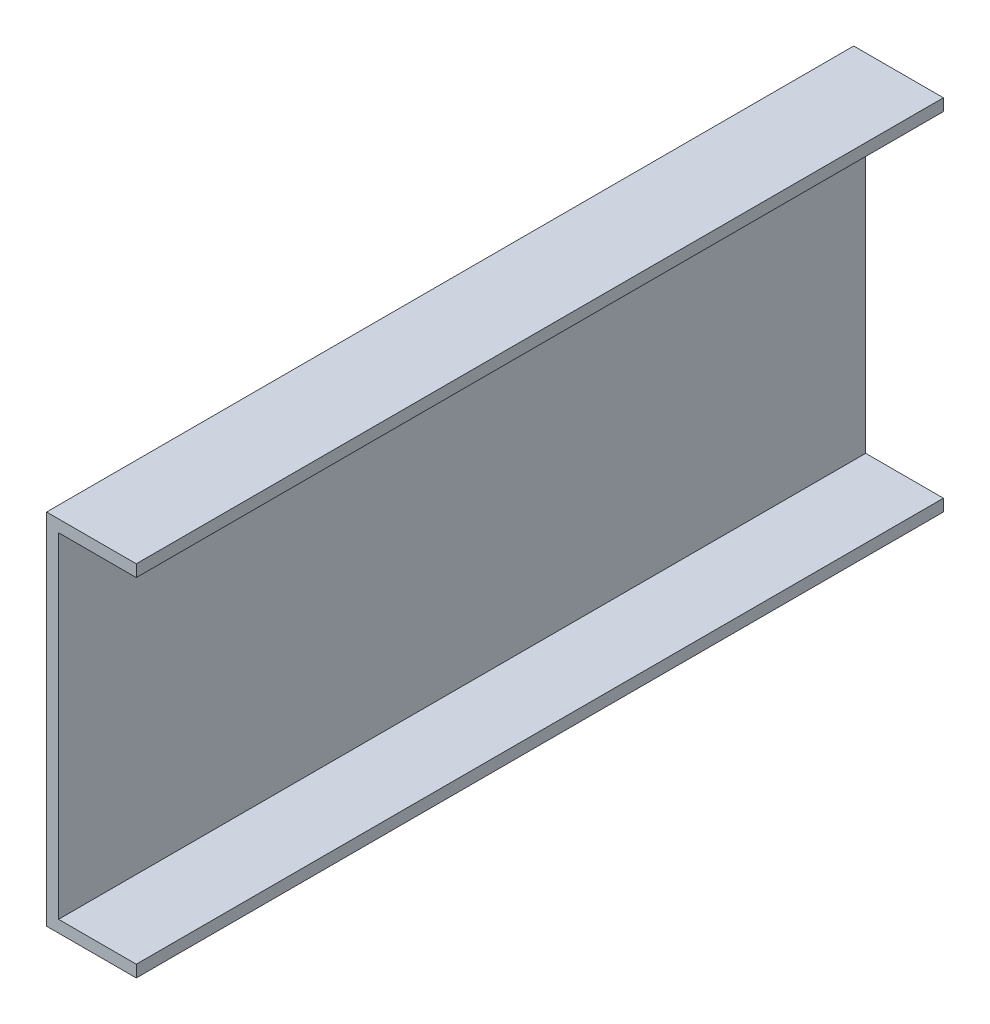
ISO-10303-21;
HEADER;
FILE_DESCRIPTION(('STEP AP214'),'2;1');
FILE_NAME('part.step','',(''),(''),'','','');
FILE_SCHEMA(('AUTOMOTIVE_DESIGN { 1 0 10303 214 1 1 1 1 }'));
ENDSEC;
DATA;
#1=APPLICATION_CONTEXT('core data for automotive mechanical design processes');
#2=APPLICATION_PROTOCOL_DEFINITION('international standard','automotive_design',2000,#1);
#3=PRODUCT_CONTEXT('',#1,'mechanical');
#4=PRODUCT('Part','Part','',(#3));
#5=PRODUCT_RELATED_PRODUCT_CATEGORY('part','',(#4));
#6=PRODUCT_DEFINITION_FORMATION('','',#4);
#7=PRODUCT_DEFINITION_CONTEXT('part definition',#1,'design');
#8=PRODUCT_DEFINITION('design','',#6,#7);
#9=PRODUCT_DEFINITION_SHAPE('','',#8);
#10=(LENGTH_UNIT() NAMED_UNIT(*) SI_UNIT(.MILLI.,.METRE.));
#11=(NAMED_UNIT(*) PLANE_ANGLE_UNIT() SI_UNIT($,.RADIAN.));
#12=(NAMED_UNIT(*) SI_UNIT($,.STERADIAN.) SOLID_ANGLE_UNIT());
#13=UNCERTAINTY_MEASURE_WITH_UNIT(LENGTH_MEASURE(1.E-05),#10,'distance_accuracy_value','');
#14=(GEOMETRIC_REPRESENTATION_CONTEXT(3) GLOBAL_UNCERTAINTY_ASSIGNED_CONTEXT((#13)) GLOBAL_UNIT_ASSIGNED_CONTEXT((#10,
#11,#12)) REPRESENTATION_CONTEXT('',''));
#15=CARTESIAN_POINT('',(0.,0.,0.));
#16=DIRECTION('',(0.,0.,1.));
#17=DIRECTION('',(1.,0.,0.));
#18=AXIS2_PLACEMENT_3D('',#15,#16,#17);
#19=CARTESIAN_POINT('',(-135.157664233577,47.2402919708029,171.45));
#20=DIRECTION('',(0.,1.,0.));
#21=DIRECTION('',(0.,0.,1.));
#22=AXIS2_PLACEMENT_3D('',#19,#20,#21);
#23=PLANE('',#22);
#24=DIRECTION('',(1.,0.,0.));
#25=VECTOR('',#24,1.);
#26=CARTESIAN_POINT('',(-135.157664233577,47.2402919708029,0.));
#27=LINE('',#26,#25);
#28=CARTESIAN_POINT('',(-132.617664233577,47.2402919708029,0.));
#29=VERTEX_POINT('',#28);
#30=CARTESIAN_POINT('',(-116.107664233577,47.2402919708029,0.));
#31=VERTEX_POINT('',#30);
#32=EDGE_CURVE('E132',#29,#31,#27,.T.);
#33=ORIENTED_EDGE('',*,*,#32,.T.);
#34=DIRECTION('',(0.,0.,-1.));
#35=VECTOR('',#34,1.);
#36=CARTESIAN_POINT('',(-116.107664233577,47.2402919708029,171.45));
#37=LINE('',#36,#35);
#38=CARTESIAN_POINT('',(-116.107664233577,47.2402919708029,171.45));
#39=VERTEX_POINT('',#38);
#40=EDGE_CURVE('E11',#39,#31,#37,.T.);
#41=ORIENTED_EDGE('',*,*,#40,.F.);
#42=DIRECTION('',(1.,0.,0.));
#43=VECTOR('',#42,1.);
#44=CARTESIAN_POINT('',(-135.157664233577,47.2402919708029,171.45));
#45=LINE('',#44,#43);
#46=CARTESIAN_POINT('',(-132.617664233577,47.2402919708029,171.45));
#47=VERTEX_POINT('',#46);
#48=EDGE_CURVE('E90',#47,#39,#45,.T.);
#49=ORIENTED_EDGE('',*,*,#48,.F.);
#50=DIRECTION('',(0.,0.,-1.));
#51=VECTOR('',#50,1.);
#52=CARTESIAN_POINT('',(-132.617664233577,47.2402919708029,171.45));
#53=LINE('',#52,#51);
#54=EDGE_CURVE('E131',#47,#29,#53,.T.);
#55=ORIENTED_EDGE('',*,*,#54,.T.);
#56=EDGE_LOOP('',(#33,#41,#49,#55));
#57=FACE_BOUND('',#56,.T.);
#58=ADVANCED_FACE('F35',(#57),#23,.F.);
#59=CARTESIAN_POINT('',(-116.107664233577,49.7802919708029,171.45));
#60=DIRECTION('',(1.,0.,0.));
#61=DIRECTION('',(0.,0.,-1.));
#62=AXIS2_PLACEMENT_3D('',#59,#60,#61);
#63=PLANE('',#62);
#64=DIRECTION('',(0.,-1.,0.));
#65=VECTOR('',#64,1.);
#66=CARTESIAN_POINT('',(-116.107664233577,49.7802919708029,0.));
#67=LINE('',#66,#65);
#68=CARTESIAN_POINT('',(-116.107664233577,49.7802919708029,0.));
#69=VERTEX_POINT('',#68);
#70=EDGE_CURVE('E135',#69,#31,#67,.T.);
#71=ORIENTED_EDGE('',*,*,#70,.F.);
#72=DIRECTION('',(0.,0.,-1.));
#73=VECTOR('',#72,1.);
#74=CARTESIAN_POINT('',(-116.107664233577,49.7802919708029,171.45));
#75=LINE('',#74,#73);
#76=CARTESIAN_POINT('',(-116.107664233577,49.7802919708029,171.45));
#77=VERTEX_POINT('',#76);
#78=EDGE_CURVE('E43',#77,#69,#75,.T.);
#79=ORIENTED_EDGE('',*,*,#78,.F.);
#80=DIRECTION('',(0.,-1.,0.));
#81=VECTOR('',#80,1.);
#82=CARTESIAN_POINT('',(-116.107664233577,49.7802919708029,171.45));
#83=LINE('',#82,#81);
#84=EDGE_CURVE('E174',#77,#39,#83,.T.);
#85=ORIENTED_EDGE('',*,*,#84,.T.);
#86=ORIENTED_EDGE('',*,*,#40,.T.);
#87=EDGE_LOOP('',(#71,#79,#85,#86));
#88=FACE_BOUND('',#87,.T.);
#89=ADVANCED_FACE('F165',(#88),#63,.T.);
#90=CARTESIAN_POINT('',(-135.157664233577,49.7802919708029,171.45));
#91=DIRECTION('',(0.,1.,0.));
#92=DIRECTION('',(0.,0.,1.));
#93=AXIS2_PLACEMENT_3D('',#90,#91,#92);
#94=PLANE('',#93);
#95=DIRECTION('',(1.,0.,0.));
#96=VECTOR('',#95,1.);
#97=CARTESIAN_POINT('',(-135.157664233577,49.7802919708029,0.));
#98=LINE('',#97,#96);
#99=CARTESIAN_POINT('',(-135.157664233577,49.7802919708029,0.));
#100=VERTEX_POINT('',#99);
#101=EDGE_CURVE('E138',#100,#69,#98,.T.);
#102=ORIENTED_EDGE('',*,*,#101,.F.);
#103=DIRECTION('',(0.,0.,-1.));
#104=VECTOR('',#103,1.);
#105=CARTESIAN_POINT('',(-135.157664233577,49.7802919708029,171.45));
#106=LINE('',#105,#104);
#107=CARTESIAN_POINT('',(-135.157664233577,49.7802919708029,171.45));
#108=VERTEX_POINT('',#107);
#109=EDGE_CURVE('E155',#108,#100,#106,.T.);
#110=ORIENTED_EDGE('',*,*,#109,.F.);
#111=DIRECTION('',(1.,0.,0.));
#112=VECTOR('',#111,1.);
#113=CARTESIAN_POINT('',(-135.157664233577,49.7802919708029,171.45));
#114=LINE('',#113,#112);
#115=EDGE_CURVE('E162',#108,#77,#114,.T.);
#116=ORIENTED_EDGE('',*,*,#115,.T.);
#117=ORIENTED_EDGE('',*,*,#78,.T.);
#118=EDGE_LOOP('',(#102,#110,#116,#117));
#119=FACE_BOUND('',#118,.T.);
#120=ADVANCED_FACE('F160',(#119),#94,.T.);
#121=CARTESIAN_POINT('',(-135.157664233577,49.7802919708029,171.45));
#122=DIRECTION('',(-1.,0.,0.));
#123=DIRECTION('',(0.,0.,1.));
#124=AXIS2_PLACEMENT_3D('',#121,#122,#123);
#125=PLANE('',#124);
#126=DIRECTION('',(0.,1.,0.));
#127=VECTOR('',#126,1.);
#128=CARTESIAN_POINT('',(-135.157664233577,49.7802919708029,0.));
#129=LINE('',#128,#127);
#130=CARTESIAN_POINT('',(-135.157664233577,-26.4197080291971,0.));
#131=VERTEX_POINT('',#130);
#132=EDGE_CURVE('E141',#131,#100,#129,.T.);
#133=ORIENTED_EDGE('',*,*,#132,.F.);
#134=DIRECTION('',(0.,0.,-1.));
#135=VECTOR('',#134,1.);
#136=CARTESIAN_POINT('',(-135.157664233577,-26.4197080291971,171.45));
#137=LINE('',#136,#135);
#138=CARTESIAN_POINT('',(-135.157664233577,-26.4197080291971,171.45));
#139=VERTEX_POINT('',#138);
#140=EDGE_CURVE('E153',#139,#131,#137,.T.);
#141=ORIENTED_EDGE('',*,*,#140,.F.);
#142=DIRECTION('',(0.,1.,0.));
#143=VECTOR('',#142,1.);
#144=CARTESIAN_POINT('',(-135.157664233577,49.7802919708029,171.45));
#145=LINE('',#144,#143);
#146=EDGE_CURVE('E126',#139,#108,#145,.T.);
#147=ORIENTED_EDGE('',*,*,#146,.T.);
#148=ORIENTED_EDGE('',*,*,#109,.T.);
#149=EDGE_LOOP('',(#133,#141,#147,#148));
#150=FACE_BOUND('',#149,.T.);
#151=ADVANCED_FACE('F172',(#150),#125,.T.);
#152=CARTESIAN_POINT('',(-135.157664233577,-26.4197080291971,171.45));
#153=DIRECTION('',(0.,-1.,0.));
#154=DIRECTION('',(0.,0.,-1.));
#155=AXIS2_PLACEMENT_3D('',#152,#153,#154);
#156=PLANE('',#155);
#157=DIRECTION('',(-1.,0.,0.));
#158=VECTOR('',#157,1.);
#159=CARTESIAN_POINT('',(-135.157664233577,-26.4197080291971,0.));
#160=LINE('',#159,#158);
#161=CARTESIAN_POINT('',(-116.107664233577,-26.4197080291971,0.));
#162=VERTEX_POINT('',#161);
#163=EDGE_CURVE('E144',#162,#131,#160,.T.);
#164=ORIENTED_EDGE('',*,*,#163,.F.);
#165=DIRECTION('',(0.,0.,-1.));
#166=VECTOR('',#165,1.);
#167=CARTESIAN_POINT('',(-116.107664233577,-26.4197080291971,171.45));
#168=LINE('',#167,#166);
#169=CARTESIAN_POINT('',(-116.107664233577,-26.4197080291971,171.45));
#170=VERTEX_POINT('',#169);
#171=EDGE_CURVE('E114',#170,#162,#168,.T.);
#172=ORIENTED_EDGE('',*,*,#171,.F.);
#173=DIRECTION('',(-1.,0.,0.));
#174=VECTOR('',#173,1.);
#175=CARTESIAN_POINT('',(-135.157664233577,-26.4197080291971,171.45));
#176=LINE('',#175,#174);
#177=EDGE_CURVE('E124',#170,#139,#176,.T.);
#178=ORIENTED_EDGE('',*,*,#177,.T.);
#179=ORIENTED_EDGE('',*,*,#140,.T.);
#180=EDGE_LOOP('',(#164,#172,#178,#179));
#181=FACE_BOUND('',#180,.T.);
#182=ADVANCED_FACE('F179',(#181),#156,.T.);
#183=CARTESIAN_POINT('',(-116.107664233577,-23.8797080291971,171.45));
#184=DIRECTION('',(1.,0.,0.));
#185=DIRECTION('',(0.,0.,-1.));
#186=AXIS2_PLACEMENT_3D('',#183,#184,#185);
#187=PLANE('',#186);
#188=DIRECTION('',(0.,-1.,0.));
#189=VECTOR('',#188,1.);
#190=CARTESIAN_POINT('',(-116.107664233577,-23.8797080291971,0.));
#191=LINE('',#190,#189);
#192=CARTESIAN_POINT('',(-116.107664233577,-23.8797080291971,0.));
#193=VERTEX_POINT('',#192);
#194=EDGE_CURVE('E113',#193,#162,#191,.T.);
#195=ORIENTED_EDGE('',*,*,#194,.F.);
#196=DIRECTION('',(0.,0.,-1.));
#197=VECTOR('',#196,1.);
#198=CARTESIAN_POINT('',(-116.107664233577,-23.8797080291971,171.45));
#199=LINE('',#198,#197);
#200=CARTESIAN_POINT('',(-116.107664233577,-23.8797080291971,171.45));
#201=VERTEX_POINT('',#200);
#202=EDGE_CURVE('E107',#201,#193,#199,.T.);
#203=ORIENTED_EDGE('',*,*,#202,.F.);
#204=DIRECTION('',(0.,-1.,0.));
#205=VECTOR('',#204,1.);
#206=CARTESIAN_POINT('',(-116.107664233577,-23.8797080291971,171.45));
#207=LINE('',#206,#205);
#208=EDGE_CURVE('E111',#201,#170,#207,.T.);
#209=ORIENTED_EDGE('',*,*,#208,.T.);
#210=ORIENTED_EDGE('',*,*,#171,.T.);
#211=EDGE_LOOP('',(#195,#203,#209,#210));
#212=FACE_BOUND('',#211,.T.);
#213=ADVANCED_FACE('F109',(#212),#187,.T.);
#214=CARTESIAN_POINT('',(-135.157664233577,-23.8797080291971,171.45));
#215=DIRECTION('',(0.,-1.,0.));
#216=DIRECTION('',(0.,0.,-1.));
#217=AXIS2_PLACEMENT_3D('',#214,#215,#216);
#218=PLANE('',#217);
#219=DIRECTION('',(1.,0.,0.));
#220=VECTOR('',#219,1.);
#221=CARTESIAN_POINT('',(-135.157664233577,-23.8797080291971,0.));
#222=LINE('',#221,#220);
#223=CARTESIAN_POINT('',(-132.617664233577,-23.8797080291971,0.));
#224=VERTEX_POINT('',#223);
#225=EDGE_CURVE('E78',#193,#224,#222,.F.);
#226=ORIENTED_EDGE('',*,*,#225,.T.);
#227=DIRECTION('',(0.,0.,-1.));
#228=VECTOR('',#227,1.);
#229=CARTESIAN_POINT('',(-132.617664233577,-23.8797080291971,171.45));
#230=LINE('',#229,#228);
#231=CARTESIAN_POINT('',(-132.617664233577,-23.8797080291971,171.45));
#232=VERTEX_POINT('',#231);
#233=EDGE_CURVE('E115',#232,#224,#230,.T.);
#234=ORIENTED_EDGE('',*,*,#233,.F.);
#235=DIRECTION('',(1.,0.,0.));
#236=VECTOR('',#235,1.);
#237=CARTESIAN_POINT('',(-135.157664233577,-23.8797080291971,171.45));
#238=LINE('',#237,#236);
#239=EDGE_CURVE('E117',#201,#232,#238,.F.);
#240=ORIENTED_EDGE('',*,*,#239,.F.);
#241=ORIENTED_EDGE('',*,*,#202,.T.);
#242=EDGE_LOOP('',(#226,#234,#240,#241));
#243=FACE_BOUND('',#242,.T.);
#244=ADVANCED_FACE('F118',(#243),#218,.F.);
#245=CARTESIAN_POINT('',(-132.617664233577,49.7802919708029,171.45));
#246=DIRECTION('',(-1.,0.,0.));
#247=DIRECTION('',(0.,0.,1.));
#248=AXIS2_PLACEMENT_3D('',#245,#246,#247);
#249=PLANE('',#248);
#250=DIRECTION('',(0.,1.,0.));
#251=VECTOR('',#250,1.);
#252=CARTESIAN_POINT('',(-132.617664233577,49.7802919708029,0.));
#253=LINE('',#252,#251);
#254=EDGE_CURVE('E84',#224,#29,#253,.T.);
#255=ORIENTED_EDGE('',*,*,#254,.T.);
#256=ORIENTED_EDGE('',*,*,#54,.F.);
#257=DIRECTION('',(0.,1.,0.));
#258=VECTOR('',#257,1.);
#259=CARTESIAN_POINT('',(-132.617664233577,49.7802919708029,171.45));
#260=LINE('',#259,#258);
#261=EDGE_CURVE('E51',#232,#47,#260,.T.);
#262=ORIENTED_EDGE('',*,*,#261,.F.);
#263=ORIENTED_EDGE('',*,*,#233,.T.);
#264=EDGE_LOOP('',(#255,#256,#262,#263));
#265=FACE_BOUND('',#264,.T.);
#266=ADVANCED_FACE('F181',(#265),#249,.F.);
#267=CARTESIAN_POINT('',(0.,0.,171.45));
#268=DIRECTION('',(0.,0.,-1.));
#269=DIRECTION('',(-1.,0.,0.));
#270=AXIS2_PLACEMENT_3D('',#267,#268,#269);
#271=PLANE('',#270);
#272=ORIENTED_EDGE('',*,*,#48,.T.);
#273=ORIENTED_EDGE('',*,*,#84,.F.);
#274=ORIENTED_EDGE('',*,*,#115,.F.);
#275=ORIENTED_EDGE('',*,*,#146,.F.);
#276=ORIENTED_EDGE('',*,*,#177,.F.);
#277=ORIENTED_EDGE('',*,*,#208,.F.);
#278=ORIENTED_EDGE('',*,*,#239,.T.);
#279=ORIENTED_EDGE('',*,*,#261,.T.);
#280=EDGE_LOOP('',(#272,#273,#274,#275,#276,#277,#278,#279));
#281=FACE_BOUND('',#280,.T.);
#282=ADVANCED_FACE('F121',(#281),#271,.F.);
#283=CARTESIAN_POINT('',(0.,0.,0.));
#284=DIRECTION('',(0.,0.,-1.));
#285=DIRECTION('',(-1.,0.,0.));
#286=AXIS2_PLACEMENT_3D('',#283,#284,#285);
#287=PLANE('',#286);
#288=ORIENTED_EDGE('',*,*,#32,.F.);
#289=ORIENTED_EDGE('',*,*,#254,.F.);
#290=ORIENTED_EDGE('',*,*,#225,.F.);
#291=ORIENTED_EDGE('',*,*,#194,.T.);
#292=ORIENTED_EDGE('',*,*,#163,.T.);
#293=ORIENTED_EDGE('',*,*,#132,.T.);
#294=ORIENTED_EDGE('',*,*,#101,.T.);
#295=ORIENTED_EDGE('',*,*,#70,.T.);
#296=EDGE_LOOP('',(#288,#289,#290,#291,#292,#293,#294,#295));
#297=FACE_BOUND('',#296,.T.);
#298=ADVANCED_FACE('F168',(#297),#287,.T.);
#299=CLOSED_SHELL('',(#58,#89,#120,#151,#182,#213,#244,#266,#282,#298));
#300=MANIFOLD_SOLID_BREP('B2',#299);
#301=ADVANCED_BREP_SHAPE_REPRESENTATION('',(#18,#300),#14);
#302=SHAPE_DEFINITION_REPRESENTATION(#9,#301);
ENDSEC;
END-ISO-10303-21;
